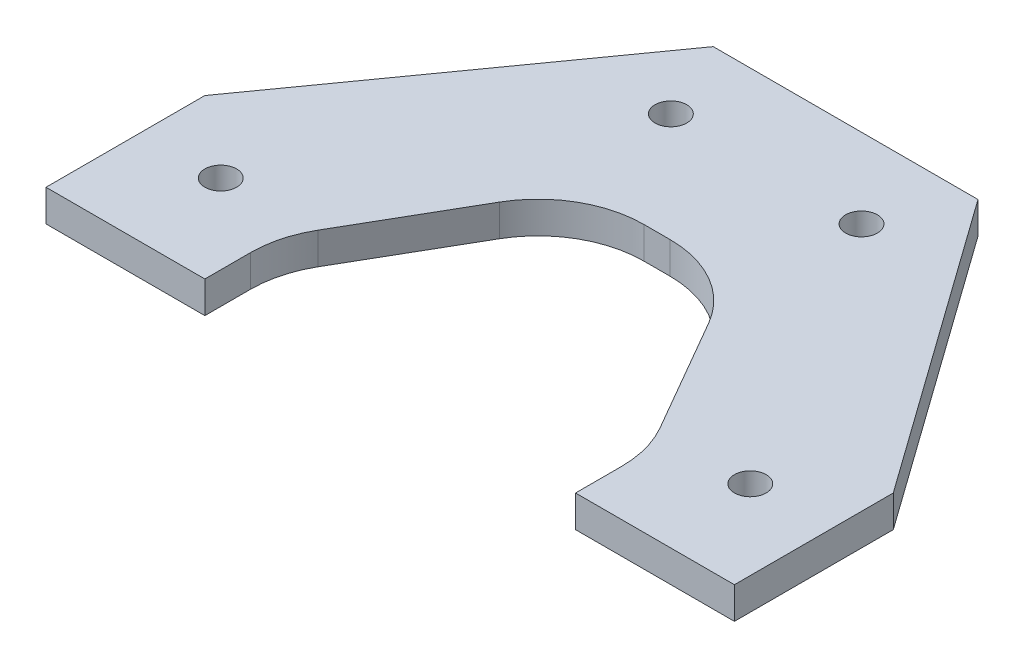
ISO-10303-21;
HEADER;
FILE_DESCRIPTION(('STEP AP214'),'2;1');
FILE_NAME('part.step','',(''),(''),'','','');
FILE_SCHEMA(('AUTOMOTIVE_DESIGN { 1 0 10303 214 1 1 1 1 }'));
ENDSEC;
DATA;
#1=APPLICATION_CONTEXT('core data for automotive mechanical design processes');
#2=APPLICATION_PROTOCOL_DEFINITION('international standard','automotive_design',2000,#1);
#3=PRODUCT_CONTEXT('',#1,'mechanical');
#4=PRODUCT('Part','Part','',(#3));
#5=PRODUCT_RELATED_PRODUCT_CATEGORY('part','',(#4));
#6=PRODUCT_DEFINITION_FORMATION('','',#4);
#7=PRODUCT_DEFINITION_CONTEXT('part definition',#1,'design');
#8=PRODUCT_DEFINITION('design','',#6,#7);
#9=PRODUCT_DEFINITION_SHAPE('','',#8);
#10=(LENGTH_UNIT() NAMED_UNIT(*) SI_UNIT(.MILLI.,.METRE.));
#11=(NAMED_UNIT(*) PLANE_ANGLE_UNIT() SI_UNIT($,.RADIAN.));
#12=(NAMED_UNIT(*) SI_UNIT($,.STERADIAN.) SOLID_ANGLE_UNIT());
#13=UNCERTAINTY_MEASURE_WITH_UNIT(LENGTH_MEASURE(1.E-05),#10,'distance_accuracy_value','');
#14=(GEOMETRIC_REPRESENTATION_CONTEXT(3) GLOBAL_UNCERTAINTY_ASSIGNED_CONTEXT((#13)) GLOBAL_UNIT_ASSIGNED_CONTEXT((#10,
#11,#12)) REPRESENTATION_CONTEXT('',''));
#15=CARTESIAN_POINT('',(0.,0.,0.));
#16=DIRECTION('',(0.,0.,1.));
#17=DIRECTION('',(1.,0.,0.));
#18=AXIS2_PLACEMENT_3D('',#15,#16,#17);
#19=CARTESIAN_POINT('',(-20.,3.,28.));
#20=DIRECTION('',(0.813733471206735,0.,0.581238193719096));
#21=DIRECTION('',(0.581238193719096,0.,-0.813733471206735));
#22=AXIS2_PLACEMENT_3D('',#19,#20,#21);
#23=PLANE('',#22);
#24=DIRECTION('',(-0.581238193719096,0.,0.813733471206735));
#25=VECTOR('',#24,1.);
#26=CARTESIAN_POINT('',(-20.,0.,28.));
#27=LINE('',#26,#25);
#28=CARTESIAN_POINT('',(0.,0.,0.));
#29=VERTEX_POINT('',#28);
#30=CARTESIAN_POINT('',(-20.,0.,28.));
#31=VERTEX_POINT('',#30);
#32=EDGE_CURVE('E181',#29,#31,#27,.T.);
#33=ORIENTED_EDGE('',*,*,#32,.T.);
#34=DIRECTION('',(0.,-1.,0.));
#35=VECTOR('',#34,1.);
#36=CARTESIAN_POINT('',(-20.,3.,28.));
#37=LINE('',#36,#35);
#38=CARTESIAN_POINT('',(-20.,3.,28.));
#39=VERTEX_POINT('',#38);
#40=EDGE_CURVE('E11',#39,#31,#37,.T.);
#41=ORIENTED_EDGE('',*,*,#40,.F.);
#42=DIRECTION('',(-0.581238193719096,0.,0.813733471206735));
#43=VECTOR('',#42,1.);
#44=CARTESIAN_POINT('',(-20.,3.,28.));
#45=LINE('',#44,#43);
#46=CARTESIAN_POINT('',(0.,3.,0.));
#47=VERTEX_POINT('',#46);
#48=EDGE_CURVE('E212',#47,#39,#45,.T.);
#49=ORIENTED_EDGE('',*,*,#48,.F.);
#50=DIRECTION('',(0.,-1.,0.));
#51=VECTOR('',#50,1.);
#52=CARTESIAN_POINT('',(0.,3.,0.));
#53=LINE('',#52,#51);
#54=EDGE_CURVE('E177',#47,#29,#53,.T.);
#55=ORIENTED_EDGE('',*,*,#54,.T.);
#56=EDGE_LOOP('',(#33,#41,#49,#55));
#57=FACE_BOUND('',#56,.T.);
#58=ADVANCED_FACE('F37',(#57),#23,.F.);
#59=CARTESIAN_POINT('',(-20.,3.,43.));
#60=DIRECTION('',(1.,0.,0.));
#61=DIRECTION('',(0.,0.,-1.));
#62=AXIS2_PLACEMENT_3D('',#59,#60,#61);
#63=PLANE('',#62);
#64=DIRECTION('',(0.,0.,1.));
#65=VECTOR('',#64,1.);
#66=CARTESIAN_POINT('',(-20.,0.,43.));
#67=LINE('',#66,#65);
#68=CARTESIAN_POINT('',(-20.,0.,43.));
#69=VERTEX_POINT('',#68);
#70=EDGE_CURVE('E184',#31,#69,#67,.T.);
#71=ORIENTED_EDGE('',*,*,#70,.T.);
#72=DIRECTION('',(0.,-1.,0.));
#73=VECTOR('',#72,1.);
#74=CARTESIAN_POINT('',(-20.,3.,43.));
#75=LINE('',#74,#73);
#76=CARTESIAN_POINT('',(-20.,3.,43.));
#77=VERTEX_POINT('',#76);
#78=EDGE_CURVE('E45',#77,#69,#75,.T.);
#79=ORIENTED_EDGE('',*,*,#78,.F.);
#80=DIRECTION('',(0.,0.,1.));
#81=VECTOR('',#80,1.);
#82=CARTESIAN_POINT('',(-20.,3.,43.));
#83=LINE('',#82,#81);
#84=EDGE_CURVE('E120',#39,#77,#83,.T.);
#85=ORIENTED_EDGE('',*,*,#84,.F.);
#86=ORIENTED_EDGE('',*,*,#40,.T.);
#87=EDGE_LOOP('',(#71,#79,#85,#86));
#88=FACE_BOUND('',#87,.T.);
#89=ADVANCED_FACE('F311',(#88),#63,.F.);
#90=CARTESIAN_POINT('',(-5.,3.,43.));
#91=DIRECTION('',(0.,0.,-1.));
#92=DIRECTION('',(-1.,0.,0.));
#93=AXIS2_PLACEMENT_3D('',#90,#91,#92);
#94=PLANE('',#93);
#95=DIRECTION('',(1.,0.,0.));
#96=VECTOR('',#95,1.);
#97=CARTESIAN_POINT('',(-5.,0.,43.));
#98=LINE('',#97,#96);
#99=CARTESIAN_POINT('',(-5.,0.,43.));
#100=VERTEX_POINT('',#99);
#101=EDGE_CURVE('E187',#69,#100,#98,.T.);
#102=ORIENTED_EDGE('',*,*,#101,.T.);
#103=DIRECTION('',(0.,-1.,0.));
#104=VECTOR('',#103,1.);
#105=CARTESIAN_POINT('',(-5.,3.,43.));
#106=LINE('',#105,#104);
#107=CARTESIAN_POINT('',(-5.,3.,43.));
#108=VERTEX_POINT('',#107);
#109=EDGE_CURVE('E243',#108,#100,#106,.T.);
#110=ORIENTED_EDGE('',*,*,#109,.F.);
#111=DIRECTION('',(1.,0.,0.));
#112=VECTOR('',#111,1.);
#113=CARTESIAN_POINT('',(-5.,3.,43.));
#114=LINE('',#113,#112);
#115=EDGE_CURVE('E251',#77,#108,#114,.T.);
#116=ORIENTED_EDGE('',*,*,#115,.F.);
#117=ORIENTED_EDGE('',*,*,#78,.T.);
#118=EDGE_LOOP('',(#102,#110,#116,#117));
#119=FACE_BOUND('',#118,.T.);
#120=ADVANCED_FACE('F249',(#119),#94,.F.);
#121=CARTESIAN_POINT('',(-5.,3.,38.6794919243113));
#122=DIRECTION('',(-1.,0.,0.));
#123=DIRECTION('',(0.,0.,1.));
#124=AXIS2_PLACEMENT_3D('',#121,#122,#123);
#125=PLANE('',#124);
#126=DIRECTION('',(0.,0.,-1.));
#127=VECTOR('',#126,1.);
#128=CARTESIAN_POINT('',(-5.,0.,38.6794919243113));
#129=LINE('',#128,#127);
#130=CARTESIAN_POINT('',(-5.,0.,38.6794919243112));
#131=VERTEX_POINT('',#130);
#132=EDGE_CURVE('E189',#100,#131,#129,.T.);
#133=ORIENTED_EDGE('',*,*,#132,.T.);
#134=DIRECTION('',(0.,-1.,0.));
#135=VECTOR('',#134,1.);
#136=CARTESIAN_POINT('',(-5.,3.,38.6794919243112));
#137=LINE('',#136,#135);
#138=CARTESIAN_POINT('',(-5.,3.,38.6794919243112));
#139=VERTEX_POINT('',#138);
#140=EDGE_CURVE('E240',#139,#131,#137,.T.);
#141=ORIENTED_EDGE('',*,*,#140,.F.);
#142=DIRECTION('',(0.,0.,-1.));
#143=VECTOR('',#142,1.);
#144=CARTESIAN_POINT('',(-5.,3.,38.6794919243113));
#145=LINE('',#144,#143);
#146=EDGE_CURVE('E269',#108,#139,#145,.T.);
#147=ORIENTED_EDGE('',*,*,#146,.F.);
#148=ORIENTED_EDGE('',*,*,#109,.T.);
#149=EDGE_LOOP('',(#133,#141,#147,#148));
#150=FACE_BOUND('',#149,.T.);
#151=ADVANCED_FACE('F260',(#150),#125,.F.);
#152=CARTESIAN_POINT('',(5.,3.,38.6794919243112));
#153=DIRECTION('',(0.,-1.,0.));
#154=DIRECTION('',(0.,0.,-1.));
#155=AXIS2_PLACEMENT_3D('',#152,#153,#154);
#156=CYLINDRICAL_SURFACE('',#155,10.);
#157=CARTESIAN_POINT('',(5.,0.,38.6794919243112));
#158=DIRECTION('',(0.,-1.,0.));
#159=DIRECTION('',(0.,0.,1.));
#160=AXIS2_PLACEMENT_3D('',#157,#158,#159);
#161=CIRCLE('',#160,10.);
#162=CARTESIAN_POINT('',(-3.66025403784438,0.,33.6794919243112));
#163=VERTEX_POINT('',#162);
#164=EDGE_CURVE('E191',#131,#163,#161,.T.);
#165=ORIENTED_EDGE('',*,*,#164,.T.);
#166=DIRECTION('',(0.,-1.,0.));
#167=VECTOR('',#166,1.);
#168=CARTESIAN_POINT('',(-3.66025403784438,3.,33.6794919243112));
#169=LINE('',#168,#167);
#170=CARTESIAN_POINT('',(-3.66025403784438,3.,33.6794919243112));
#171=VERTEX_POINT('',#170);
#172=EDGE_CURVE('E237',#171,#163,#169,.T.);
#173=ORIENTED_EDGE('',*,*,#172,.F.);
#174=CARTESIAN_POINT('',(5.,3.,38.6794919243112));
#175=DIRECTION('',(0.,-1.,0.));
#176=DIRECTION('',(0.,0.,1.));
#177=AXIS2_PLACEMENT_3D('',#174,#175,#176);
#178=CIRCLE('',#177,10.);
#179=EDGE_CURVE('E266',#139,#171,#178,.T.);
#180=ORIENTED_EDGE('',*,*,#179,.F.);
#181=ORIENTED_EDGE('',*,*,#140,.T.);
#182=EDGE_LOOP('',(#165,#173,#180,#181));
#183=FACE_BOUND('',#182,.T.);
#184=ADVANCED_FACE('F264',(#183),#156,.F.);
#185=CARTESIAN_POINT('',(2.61324865405186,3.,22.8134665205267));
#186=DIRECTION('',(-0.866025403784441,0.,-0.499999999999997));
#187=DIRECTION('',(-0.499999999999997,0.,0.866025403784441));
#188=AXIS2_PLACEMENT_3D('',#185,#186,#187);
#189=PLANE('',#188);
#190=DIRECTION('',(0.499999999999996,0.,-0.866025403784441));
#191=VECTOR('',#190,1.);
#192=CARTESIAN_POINT('',(2.61324865405186,0.,22.8134665205267));
#193=LINE('',#192,#191);
#194=CARTESIAN_POINT('',(2.61324865405187,0.,22.8134665205267));
#195=VERTEX_POINT('',#194);
#196=EDGE_CURVE('E193',#163,#195,#193,.T.);
#197=ORIENTED_EDGE('',*,*,#196,.T.);
#198=DIRECTION('',(0.,-1.,0.));
#199=VECTOR('',#198,1.);
#200=CARTESIAN_POINT('',(2.61324865405187,3.,22.8134665205267));
#201=LINE('',#200,#199);
#202=CARTESIAN_POINT('',(2.61324865405187,3.,22.8134665205267));
#203=VERTEX_POINT('',#202);
#204=EDGE_CURVE('E234',#203,#195,#201,.T.);
#205=ORIENTED_EDGE('',*,*,#204,.F.);
#206=DIRECTION('',(0.499999999999996,0.,-0.866025403784441));
#207=VECTOR('',#206,1.);
#208=CARTESIAN_POINT('',(2.61324865405186,3.,22.8134665205267));
#209=LINE('',#208,#207);
#210=EDGE_CURVE('E268',#171,#203,#209,.T.);
#211=ORIENTED_EDGE('',*,*,#210,.F.);
#212=ORIENTED_EDGE('',*,*,#172,.T.);
#213=EDGE_LOOP('',(#197,#205,#211,#212));
#214=FACE_BOUND('',#213,.T.);
#215=ADVANCED_FACE('F324',(#214),#189,.F.);
#216=CARTESIAN_POINT('',(11.2735026918963,3.,27.8134665205267));
#217=DIRECTION('',(0.,-1.,0.));
#218=DIRECTION('',(0.,0.,-1.));
#219=AXIS2_PLACEMENT_3D('',#216,#217,#218);
#220=CYLINDRICAL_SURFACE('',#219,10.);
#221=CARTESIAN_POINT('',(11.2735026918963,0.,27.8134665205267));
#222=DIRECTION('',(0.,-1.,0.));
#223=DIRECTION('',(0.,0.,1.));
#224=AXIS2_PLACEMENT_3D('',#221,#222,#223);
#225=CIRCLE('',#224,10.);
#226=CARTESIAN_POINT('',(11.2735026918963,0.,17.8134665205267));
#227=VERTEX_POINT('',#226);
#228=EDGE_CURVE('E195',#195,#227,#225,.T.);
#229=ORIENTED_EDGE('',*,*,#228,.T.);
#230=DIRECTION('',(0.,-1.,0.));
#231=VECTOR('',#230,1.);
#232=CARTESIAN_POINT('',(11.2735026918963,3.,17.8134665205267));
#233=LINE('',#232,#231);
#234=CARTESIAN_POINT('',(11.2735026918963,3.,17.8134665205267));
#235=VERTEX_POINT('',#234);
#236=EDGE_CURVE('E231',#235,#227,#233,.T.);
#237=ORIENTED_EDGE('',*,*,#236,.F.);
#238=CARTESIAN_POINT('',(11.2735026918963,3.,27.8134665205267));
#239=DIRECTION('',(0.,-1.,0.));
#240=DIRECTION('',(0.,0.,1.));
#241=AXIS2_PLACEMENT_3D('',#238,#239,#240);
#242=CIRCLE('',#241,10.);
#243=EDGE_CURVE('E271',#203,#235,#242,.T.);
#244=ORIENTED_EDGE('',*,*,#243,.F.);
#245=ORIENTED_EDGE('',*,*,#204,.T.);
#246=EDGE_LOOP('',(#229,#237,#244,#245));
#247=FACE_BOUND('',#246,.T.);
#248=ADVANCED_FACE('F327',(#247),#220,.F.);
#249=CARTESIAN_POINT('',(13.7264973081037,3.,17.8134665205267));
#250=DIRECTION('',(0.,0.,-1.));
#251=DIRECTION('',(-1.,0.,0.));
#252=AXIS2_PLACEMENT_3D('',#249,#250,#251);
#253=PLANE('',#252);
#254=DIRECTION('',(1.,0.,0.));
#255=VECTOR('',#254,1.);
#256=CARTESIAN_POINT('',(13.7264973081037,0.,17.8134665205267));
#257=LINE('',#256,#255);
#258=CARTESIAN_POINT('',(13.7264973081037,0.,17.8134665205267));
#259=VERTEX_POINT('',#258);
#260=EDGE_CURVE('E197',#227,#259,#257,.T.);
#261=ORIENTED_EDGE('',*,*,#260,.T.);
#262=DIRECTION('',(0.,-1.,0.));
#263=VECTOR('',#262,1.);
#264=CARTESIAN_POINT('',(13.7264973081037,3.,17.8134665205267));
#265=LINE('',#264,#263);
#266=CARTESIAN_POINT('',(13.7264973081037,3.,17.8134665205267));
#267=VERTEX_POINT('',#266);
#268=EDGE_CURVE('E228',#267,#259,#265,.T.);
#269=ORIENTED_EDGE('',*,*,#268,.F.);
#270=DIRECTION('',(1.,0.,0.));
#271=VECTOR('',#270,1.);
#272=CARTESIAN_POINT('',(13.7264973081037,3.,17.8134665205267));
#273=LINE('',#272,#271);
#274=EDGE_CURVE('E277',#235,#267,#273,.T.);
#275=ORIENTED_EDGE('',*,*,#274,.F.);
#276=ORIENTED_EDGE('',*,*,#236,.T.);
#277=EDGE_LOOP('',(#261,#269,#275,#276));
#278=FACE_BOUND('',#277,.T.);
#279=ADVANCED_FACE('F331',(#278),#253,.F.);
#280=CARTESIAN_POINT('',(13.7264973081037,3.,27.8134665205267));
#281=DIRECTION('',(0.,-1.,0.));
#282=DIRECTION('',(0.,0.,-1.));
#283=AXIS2_PLACEMENT_3D('',#280,#281,#282);
#284=CYLINDRICAL_SURFACE('',#283,10.);
#285=CARTESIAN_POINT('',(13.7264973081037,0.,27.8134665205267));
#286=DIRECTION('',(0.,-1.,0.));
#287=DIRECTION('',(0.,0.,1.));
#288=AXIS2_PLACEMENT_3D('',#285,#286,#287);
#289=CIRCLE('',#288,10.);
#290=CARTESIAN_POINT('',(22.3867513459481,0.,22.8134665205267));
#291=VERTEX_POINT('',#290);
#292=EDGE_CURVE('E199',#259,#291,#289,.T.);
#293=ORIENTED_EDGE('',*,*,#292,.T.);
#294=DIRECTION('',(0.,-1.,0.));
#295=VECTOR('',#294,1.);
#296=CARTESIAN_POINT('',(22.3867513459481,3.,22.8134665205267));
#297=LINE('',#296,#295);
#298=CARTESIAN_POINT('',(22.3867513459481,3.,22.8134665205267));
#299=VERTEX_POINT('',#298);
#300=EDGE_CURVE('E225',#299,#291,#297,.T.);
#301=ORIENTED_EDGE('',*,*,#300,.F.);
#302=CARTESIAN_POINT('',(13.7264973081037,3.,27.8134665205267));
#303=DIRECTION('',(0.,-1.,0.));
#304=DIRECTION('',(0.,0.,1.));
#305=AXIS2_PLACEMENT_3D('',#302,#303,#304);
#306=CIRCLE('',#305,10.);
#307=EDGE_CURVE('E279',#267,#299,#306,.T.);
#308=ORIENTED_EDGE('',*,*,#307,.F.);
#309=ORIENTED_EDGE('',*,*,#268,.T.);
#310=EDGE_LOOP('',(#293,#301,#308,#309));
#311=FACE_BOUND('',#310,.T.);
#312=ADVANCED_FACE('F335',(#311),#284,.F.);
#313=CARTESIAN_POINT('',(22.3867513459481,3.,22.8134665205267));
#314=DIRECTION('',(0.86602540378444,0.,-0.499999999999998));
#315=DIRECTION('',(-0.499999999999998,0.,-0.86602540378444));
#316=AXIS2_PLACEMENT_3D('',#313,#314,#315);
#317=PLANE('',#316);
#318=DIRECTION('',(0.499999999999998,0.,0.86602540378444));
#319=VECTOR('',#318,1.);
#320=CARTESIAN_POINT('',(22.3867513459481,0.,22.8134665205267));
#321=LINE('',#320,#319);
#322=CARTESIAN_POINT('',(28.6602540378444,0.,33.6794919243112));
#323=VERTEX_POINT('',#322);
#324=EDGE_CURVE('E201',#291,#323,#321,.T.);
#325=ORIENTED_EDGE('',*,*,#324,.T.);
#326=DIRECTION('',(0.,-1.,0.));
#327=VECTOR('',#326,1.);
#328=CARTESIAN_POINT('',(28.6602540378444,3.,33.6794919243112));
#329=LINE('',#328,#327);
#330=CARTESIAN_POINT('',(28.6602540378444,3.,33.6794919243112));
#331=VERTEX_POINT('',#330);
#332=EDGE_CURVE('E222',#331,#323,#329,.T.);
#333=ORIENTED_EDGE('',*,*,#332,.F.);
#334=DIRECTION('',(0.499999999999998,0.,0.86602540378444));
#335=VECTOR('',#334,1.);
#336=CARTESIAN_POINT('',(22.3867513459481,3.,22.8134665205267));
#337=LINE('',#336,#335);
#338=EDGE_CURVE('E281',#299,#331,#337,.T.);
#339=ORIENTED_EDGE('',*,*,#338,.F.);
#340=ORIENTED_EDGE('',*,*,#300,.T.);
#341=EDGE_LOOP('',(#325,#333,#339,#340));
#342=FACE_BOUND('',#341,.T.);
#343=ADVANCED_FACE('F339',(#342),#317,.F.);
#344=CARTESIAN_POINT('',(20.,3.,38.6794919243112));
#345=DIRECTION('',(0.,-1.,0.));
#346=DIRECTION('',(0.,0.,-1.));
#347=AXIS2_PLACEMENT_3D('',#344,#345,#346);
#348=CYLINDRICAL_SURFACE('',#347,9.99999999999999);
#349=CARTESIAN_POINT('',(20.,0.,38.6794919243112));
#350=DIRECTION('',(0.,-1.,0.));
#351=DIRECTION('',(0.,0.,1.));
#352=AXIS2_PLACEMENT_3D('',#349,#350,#351);
#353=CIRCLE('',#352,9.99999999999999);
#354=CARTESIAN_POINT('',(30.,0.,38.6794919243112));
#355=VERTEX_POINT('',#354);
#356=EDGE_CURVE('E203',#323,#355,#353,.T.);
#357=ORIENTED_EDGE('',*,*,#356,.T.);
#358=DIRECTION('',(0.,-1.,0.));
#359=VECTOR('',#358,1.);
#360=CARTESIAN_POINT('',(30.,3.,38.6794919243112));
#361=LINE('',#360,#359);
#362=CARTESIAN_POINT('',(30.,3.,38.6794919243112));
#363=VERTEX_POINT('',#362);
#364=EDGE_CURVE('E219',#363,#355,#361,.T.);
#365=ORIENTED_EDGE('',*,*,#364,.F.);
#366=CARTESIAN_POINT('',(20.,3.,38.6794919243112));
#367=DIRECTION('',(0.,-1.,0.));
#368=DIRECTION('',(0.,0.,1.));
#369=AXIS2_PLACEMENT_3D('',#366,#367,#368);
#370=CIRCLE('',#369,9.99999999999999);
#371=EDGE_CURVE('E283',#331,#363,#370,.T.);
#372=ORIENTED_EDGE('',*,*,#371,.F.);
#373=ORIENTED_EDGE('',*,*,#332,.T.);
#374=EDGE_LOOP('',(#357,#365,#372,#373));
#375=FACE_BOUND('',#374,.T.);
#376=ADVANCED_FACE('F343',(#375),#348,.F.);
#377=CARTESIAN_POINT('',(30.,3.,38.6794919243112));
#378=DIRECTION('',(1.,0.,0.));
#379=DIRECTION('',(0.,0.,-1.));
#380=AXIS2_PLACEMENT_3D('',#377,#378,#379);
#381=PLANE('',#380);
#382=DIRECTION('',(0.,0.,1.));
#383=VECTOR('',#382,1.);
#384=CARTESIAN_POINT('',(30.,0.,38.6794919243112));
#385=LINE('',#384,#383);
#386=CARTESIAN_POINT('',(30.,0.,43.));
#387=VERTEX_POINT('',#386);
#388=EDGE_CURVE('E205',#355,#387,#385,.T.);
#389=ORIENTED_EDGE('',*,*,#388,.T.);
#390=DIRECTION('',(0.,-1.,0.));
#391=VECTOR('',#390,1.);
#392=CARTESIAN_POINT('',(30.,3.,43.));
#393=LINE('',#392,#391);
#394=CARTESIAN_POINT('',(30.,3.,43.));
#395=VERTEX_POINT('',#394);
#396=EDGE_CURVE('E216',#395,#387,#393,.T.);
#397=ORIENTED_EDGE('',*,*,#396,.F.);
#398=DIRECTION('',(0.,0.,1.));
#399=VECTOR('',#398,1.);
#400=CARTESIAN_POINT('',(30.,3.,38.6794919243112));
#401=LINE('',#400,#399);
#402=EDGE_CURVE('E285',#363,#395,#401,.T.);
#403=ORIENTED_EDGE('',*,*,#402,.F.);
#404=ORIENTED_EDGE('',*,*,#364,.T.);
#405=EDGE_LOOP('',(#389,#397,#403,#404));
#406=FACE_BOUND('',#405,.T.);
#407=ADVANCED_FACE('F291',(#406),#381,.F.);
#408=CARTESIAN_POINT('',(30.,3.,43.));
#409=DIRECTION('',(0.,0.,-1.));
#410=DIRECTION('',(-1.,0.,0.));
#411=AXIS2_PLACEMENT_3D('',#408,#409,#410);
#412=PLANE('',#411);
#413=DIRECTION('',(1.,0.,0.));
#414=VECTOR('',#413,1.);
#415=CARTESIAN_POINT('',(30.,0.,43.));
#416=LINE('',#415,#414);
#417=CARTESIAN_POINT('',(45.,0.,43.));
#418=VERTEX_POINT('',#417);
#419=EDGE_CURVE('E207',#387,#418,#416,.T.);
#420=ORIENTED_EDGE('',*,*,#419,.T.);
#421=DIRECTION('',(0.,-1.,0.));
#422=VECTOR('',#421,1.);
#423=CARTESIAN_POINT('',(45.,3.,43.));
#424=LINE('',#423,#422);
#425=CARTESIAN_POINT('',(45.,3.,43.));
#426=VERTEX_POINT('',#425);
#427=EDGE_CURVE('E172',#426,#418,#424,.T.);
#428=ORIENTED_EDGE('',*,*,#427,.F.);
#429=DIRECTION('',(1.,0.,0.));
#430=VECTOR('',#429,1.);
#431=CARTESIAN_POINT('',(30.,3.,43.));
#432=LINE('',#431,#430);
#433=EDGE_CURVE('E163',#395,#426,#432,.T.);
#434=ORIENTED_EDGE('',*,*,#433,.F.);
#435=ORIENTED_EDGE('',*,*,#396,.T.);
#436=EDGE_LOOP('',(#420,#428,#434,#435));
#437=FACE_BOUND('',#436,.T.);
#438=ADVANCED_FACE('F295',(#437),#412,.F.);
#439=CARTESIAN_POINT('',(45.,3.,43.));
#440=DIRECTION('',(-1.,0.,0.));
#441=DIRECTION('',(0.,0.,1.));
#442=AXIS2_PLACEMENT_3D('',#439,#440,#441);
#443=PLANE('',#442);
#444=DIRECTION('',(0.,0.,-1.));
#445=VECTOR('',#444,1.);
#446=CARTESIAN_POINT('',(45.,0.,43.));
#447=LINE('',#446,#445);
#448=CARTESIAN_POINT('',(45.,0.,28.));
#449=VERTEX_POINT('',#448);
#450=EDGE_CURVE('E171',#418,#449,#447,.T.);
#451=ORIENTED_EDGE('',*,*,#450,.T.);
#452=DIRECTION('',(0.,-1.,0.));
#453=VECTOR('',#452,1.);
#454=CARTESIAN_POINT('',(45.,3.,28.));
#455=LINE('',#454,#453);
#456=CARTESIAN_POINT('',(45.,3.,28.));
#457=VERTEX_POINT('',#456);
#458=EDGE_CURVE('E168',#457,#449,#455,.T.);
#459=ORIENTED_EDGE('',*,*,#458,.F.);
#460=DIRECTION('',(0.,0.,-1.));
#461=VECTOR('',#460,1.);
#462=CARTESIAN_POINT('',(45.,3.,43.));
#463=LINE('',#462,#461);
#464=EDGE_CURVE('E157',#426,#457,#463,.T.);
#465=ORIENTED_EDGE('',*,*,#464,.F.);
#466=ORIENTED_EDGE('',*,*,#427,.T.);
#467=EDGE_LOOP('',(#451,#459,#465,#466));
#468=FACE_BOUND('',#467,.T.);
#469=ADVANCED_FACE('F169',(#468),#443,.F.);
#470=CARTESIAN_POINT('',(45.,3.,28.));
#471=DIRECTION('',(-0.813733471206735,0.,0.581238193719096));
#472=DIRECTION('',(0.581238193719096,0.,0.813733471206735));
#473=AXIS2_PLACEMENT_3D('',#470,#471,#472);
#474=PLANE('',#473);
#475=DIRECTION('',(-0.581238193719096,0.,-0.813733471206735));
#476=VECTOR('',#475,1.);
#477=CARTESIAN_POINT('',(45.,0.,28.));
#478=LINE('',#477,#476);
#479=CARTESIAN_POINT('',(25.,0.,0.));
#480=VERTEX_POINT('',#479);
#481=EDGE_CURVE('E106',#449,#480,#478,.T.);
#482=ORIENTED_EDGE('',*,*,#481,.T.);
#483=DIRECTION('',(0.,-1.,0.));
#484=VECTOR('',#483,1.);
#485=CARTESIAN_POINT('',(25.,3.,0.));
#486=LINE('',#485,#484);
#487=CARTESIAN_POINT('',(25.,3.,0.));
#488=VERTEX_POINT('',#487);
#489=EDGE_CURVE('E173',#488,#480,#486,.T.);
#490=ORIENTED_EDGE('',*,*,#489,.F.);
#491=DIRECTION('',(-0.581238193719096,0.,-0.813733471206735));
#492=VECTOR('',#491,1.);
#493=CARTESIAN_POINT('',(45.,3.,28.));
#494=LINE('',#493,#492);
#495=EDGE_CURVE('E161',#457,#488,#494,.T.);
#496=ORIENTED_EDGE('',*,*,#495,.F.);
#497=ORIENTED_EDGE('',*,*,#458,.T.);
#498=EDGE_LOOP('',(#482,#490,#496,#497));
#499=FACE_BOUND('',#498,.T.);
#500=ADVANCED_FACE('F175',(#499),#474,.F.);
#501=CARTESIAN_POINT('',(0.,3.,0.));
#502=DIRECTION('',(0.,0.,1.));
#503=DIRECTION('',(1.,0.,0.));
#504=AXIS2_PLACEMENT_3D('',#501,#502,#503);
#505=PLANE('',#504);
#506=DIRECTION('',(-1.,0.,0.));
#507=VECTOR('',#506,1.);
#508=CARTESIAN_POINT('',(0.,0.,0.));
#509=LINE('',#508,#507);
#510=EDGE_CURVE('E112',#480,#29,#509,.T.);
#511=ORIENTED_EDGE('',*,*,#510,.T.);
#512=ORIENTED_EDGE('',*,*,#54,.F.);
#513=DIRECTION('',(-1.,0.,0.));
#514=VECTOR('',#513,1.);
#515=CARTESIAN_POINT('',(0.,3.,0.));
#516=LINE('',#515,#514);
#517=EDGE_CURVE('E53',#488,#47,#516,.T.);
#518=ORIENTED_EDGE('',*,*,#517,.F.);
#519=ORIENTED_EDGE('',*,*,#489,.T.);
#520=EDGE_LOOP('',(#511,#512,#518,#519));
#521=FACE_BOUND('',#520,.T.);
#522=ADVANCED_FACE('F299',(#521),#505,.F.);
#523=CARTESIAN_POINT('',(20.,3.,38.6794919243112));
#524=DIRECTION('',(0.,1.,0.));
#525=DIRECTION('',(0.,0.,1.));
#526=AXIS2_PLACEMENT_3D('',#523,#524,#525);
#527=PLANE('',#526);
#528=CARTESIAN_POINT('',(-12.5,3.,34.));
#529=DIRECTION('',(0.,1.,0.));
#530=DIRECTION('',(0.,0.,1.));
#531=AXIS2_PLACEMENT_3D('',#528,#529,#530);
#532=CIRCLE('',#531,1.5);
#533=CARTESIAN_POINT('',(-12.5,3.,35.5));
#534=VERTEX_POINT('',#533);
#535=EDGE_CURVE('E428',#534,#534,#532,.T.);
#536=ORIENTED_EDGE('',*,*,#535,.F.);
#537=EDGE_LOOP('',(#536));
#538=FACE_BOUND('',#537,.T.);
#539=CARTESIAN_POINT('',(37.5,3.,34.));
#540=DIRECTION('',(0.,1.,0.));
#541=DIRECTION('',(0.,0.,1.));
#542=AXIS2_PLACEMENT_3D('',#539,#540,#541);
#543=CIRCLE('',#542,1.5);
#544=CARTESIAN_POINT('',(37.5,3.,35.5));
#545=VERTEX_POINT('',#544);
#546=EDGE_CURVE('E433',#545,#545,#543,.T.);
#547=ORIENTED_EDGE('',*,*,#546,.F.);
#548=EDGE_LOOP('',(#547));
#549=FACE_BOUND('',#548,.T.);
#550=CARTESIAN_POINT('',(21.5,3.,7.49999999999999));
#551=DIRECTION('',(0.,1.,0.));
#552=DIRECTION('',(0.,0.,1.));
#553=AXIS2_PLACEMENT_3D('',#550,#551,#552);
#554=CIRCLE('',#553,1.5);
#555=CARTESIAN_POINT('',(21.5,3.,8.99999999999999));
#556=VERTEX_POINT('',#555);
#557=EDGE_CURVE('E441',#556,#556,#554,.T.);
#558=ORIENTED_EDGE('',*,*,#557,.F.);
#559=EDGE_LOOP('',(#558));
#560=FACE_BOUND('',#559,.T.);
#561=CARTESIAN_POINT('',(3.5,3.,7.49999999999999));
#562=DIRECTION('',(0.,1.,0.));
#563=DIRECTION('',(0.,0.,1.));
#564=AXIS2_PLACEMENT_3D('',#561,#562,#563);
#565=CIRCLE('',#564,1.5);
#566=CARTESIAN_POINT('',(3.5,3.,8.99999999999999));
#567=VERTEX_POINT('',#566);
#568=EDGE_CURVE('E447',#567,#567,#565,.T.);
#569=ORIENTED_EDGE('',*,*,#568,.F.);
#570=EDGE_LOOP('',(#569));
#571=FACE_BOUND('',#570,.T.);
#572=ORIENTED_EDGE('',*,*,#48,.T.);
#573=ORIENTED_EDGE('',*,*,#84,.T.);
#574=ORIENTED_EDGE('',*,*,#115,.T.);
#575=ORIENTED_EDGE('',*,*,#146,.T.);
#576=ORIENTED_EDGE('',*,*,#179,.T.);
#577=ORIENTED_EDGE('',*,*,#210,.T.);
#578=ORIENTED_EDGE('',*,*,#243,.T.);
#579=ORIENTED_EDGE('',*,*,#274,.T.);
#580=ORIENTED_EDGE('',*,*,#307,.T.);
#581=ORIENTED_EDGE('',*,*,#338,.T.);
#582=ORIENTED_EDGE('',*,*,#371,.T.);
#583=ORIENTED_EDGE('',*,*,#402,.T.);
#584=ORIENTED_EDGE('',*,*,#433,.T.);
#585=ORIENTED_EDGE('',*,*,#464,.T.);
#586=ORIENTED_EDGE('',*,*,#495,.T.);
#587=ORIENTED_EDGE('',*,*,#517,.T.);
#588=EDGE_LOOP('',(#572,#573,#574,#575,#576,#577,#578,#579,#580,#581,#582,#583,#584,#585,#586,#587));
#589=FACE_BOUND('',#588,.T.);
#590=ADVANCED_FACE('F159',(#538,#549,#560,#571,#589),#527,.T.);
#591=CARTESIAN_POINT('',(20.,0.,38.6794919243112));
#592=DIRECTION('',(0.,1.,0.));
#593=DIRECTION('',(0.,0.,1.));
#594=AXIS2_PLACEMENT_3D('',#591,#592,#593);
#595=PLANE('',#594);
#596=CARTESIAN_POINT('',(-12.5,0.,34.));
#597=DIRECTION('',(0.,1.,0.));
#598=DIRECTION('',(0.,0.,1.));
#599=AXIS2_PLACEMENT_3D('',#596,#597,#598);
#600=CIRCLE('',#599,1.5);
#601=CARTESIAN_POINT('',(-12.5,0.,35.5));
#602=VERTEX_POINT('',#601);
#603=EDGE_CURVE('E185',#602,#602,#600,.T.);
#604=ORIENTED_EDGE('',*,*,#603,.T.);
#605=EDGE_LOOP('',(#604));
#606=FACE_BOUND('',#605,.T.);
#607=CARTESIAN_POINT('',(37.5,0.,34.));
#608=DIRECTION('',(0.,1.,0.));
#609=DIRECTION('',(0.,0.,1.));
#610=AXIS2_PLACEMENT_3D('',#607,#608,#609);
#611=CIRCLE('',#610,1.5);
#612=CARTESIAN_POINT('',(37.5,0.,35.5));
#613=VERTEX_POINT('',#612);
#614=EDGE_CURVE('E429',#613,#613,#611,.T.);
#615=ORIENTED_EDGE('',*,*,#614,.T.);
#616=EDGE_LOOP('',(#615));
#617=FACE_BOUND('',#616,.T.);
#618=CARTESIAN_POINT('',(21.5,0.,7.49999999999999));
#619=DIRECTION('',(0.,1.,0.));
#620=DIRECTION('',(0.,0.,1.));
#621=AXIS2_PLACEMENT_3D('',#618,#619,#620);
#622=CIRCLE('',#621,1.5);
#623=CARTESIAN_POINT('',(21.5,0.,8.99999999999999));
#624=VERTEX_POINT('',#623);
#625=EDGE_CURVE('E438',#624,#624,#622,.T.);
#626=ORIENTED_EDGE('',*,*,#625,.T.);
#627=EDGE_LOOP('',(#626));
#628=FACE_BOUND('',#627,.T.);
#629=CARTESIAN_POINT('',(3.5,0.,7.49999999999999));
#630=DIRECTION('',(0.,1.,0.));
#631=DIRECTION('',(0.,0.,1.));
#632=AXIS2_PLACEMENT_3D('',#629,#630,#631);
#633=CIRCLE('',#632,1.5);
#634=CARTESIAN_POINT('',(3.5,0.,8.99999999999999));
#635=VERTEX_POINT('',#634);
#636=EDGE_CURVE('E444',#635,#635,#633,.T.);
#637=ORIENTED_EDGE('',*,*,#636,.T.);
#638=EDGE_LOOP('',(#637));
#639=FACE_BOUND('',#638,.T.);
#640=ORIENTED_EDGE('',*,*,#32,.F.);
#641=ORIENTED_EDGE('',*,*,#510,.F.);
#642=ORIENTED_EDGE('',*,*,#481,.F.);
#643=ORIENTED_EDGE('',*,*,#450,.F.);
#644=ORIENTED_EDGE('',*,*,#419,.F.);
#645=ORIENTED_EDGE('',*,*,#388,.F.);
#646=ORIENTED_EDGE('',*,*,#356,.F.);
#647=ORIENTED_EDGE('',*,*,#324,.F.);
#648=ORIENTED_EDGE('',*,*,#292,.F.);
#649=ORIENTED_EDGE('',*,*,#260,.F.);
#650=ORIENTED_EDGE('',*,*,#228,.F.);
#651=ORIENTED_EDGE('',*,*,#196,.F.);
#652=ORIENTED_EDGE('',*,*,#164,.F.);
#653=ORIENTED_EDGE('',*,*,#132,.F.);
#654=ORIENTED_EDGE('',*,*,#101,.F.);
#655=ORIENTED_EDGE('',*,*,#70,.F.);
#656=EDGE_LOOP('',(#640,#641,#642,#643,#644,#645,#646,#647,#648,#649,#650,#651,#652,#653,#654,#655));
#657=FACE_BOUND('',#656,.T.);
#658=ADVANCED_FACE('F255',(#606,#617,#628,#639,#657),#595,.F.);
#659=CARTESIAN_POINT('',(3.5,0.,7.49999999999999));
#660=DIRECTION('',(0.,1.,0.));
#661=DIRECTION('',(0.,0.,1.));
#662=AXIS2_PLACEMENT_3D('',#659,#660,#661);
#663=CYLINDRICAL_SURFACE('',#662,1.5);
#664=ORIENTED_EDGE('',*,*,#636,.F.);
#665=EDGE_LOOP('',(#664));
#666=FACE_BOUND('',#665,.T.);
#667=ORIENTED_EDGE('',*,*,#568,.T.);
#668=EDGE_LOOP('',(#667));
#669=FACE_BOUND('',#668,.T.);
#670=ADVANCED_FACE('F380',(#666,#669),#663,.F.);
#671=CARTESIAN_POINT('',(21.5,0.,7.49999999999999));
#672=DIRECTION('',(0.,1.,0.));
#673=DIRECTION('',(0.,0.,1.));
#674=AXIS2_PLACEMENT_3D('',#671,#672,#673);
#675=CYLINDRICAL_SURFACE('',#674,1.5);
#676=ORIENTED_EDGE('',*,*,#625,.F.);
#677=EDGE_LOOP('',(#676));
#678=FACE_BOUND('',#677,.T.);
#679=ORIENTED_EDGE('',*,*,#557,.T.);
#680=EDGE_LOOP('',(#679));
#681=FACE_BOUND('',#680,.T.);
#682=ADVANCED_FACE('F389',(#678,#681),#675,.F.);
#683=CARTESIAN_POINT('',(37.5,0.,34.));
#684=DIRECTION('',(0.,1.,0.));
#685=DIRECTION('',(0.,0.,1.));
#686=AXIS2_PLACEMENT_3D('',#683,#684,#685);
#687=CYLINDRICAL_SURFACE('',#686,1.5);
#688=ORIENTED_EDGE('',*,*,#614,.F.);
#689=EDGE_LOOP('',(#688));
#690=FACE_BOUND('',#689,.T.);
#691=ORIENTED_EDGE('',*,*,#546,.T.);
#692=EDGE_LOOP('',(#691));
#693=FACE_BOUND('',#692,.T.);
#694=ADVANCED_FACE('F399',(#690,#693),#687,.F.);
#695=CARTESIAN_POINT('',(-12.5,0.,34.));
#696=DIRECTION('',(0.,1.,0.));
#697=DIRECTION('',(0.,0.,1.));
#698=AXIS2_PLACEMENT_3D('',#695,#696,#697);
#699=CYLINDRICAL_SURFACE('',#698,1.5);
#700=ORIENTED_EDGE('',*,*,#603,.F.);
#701=EDGE_LOOP('',(#700));
#702=FACE_BOUND('',#701,.T.);
#703=ORIENTED_EDGE('',*,*,#535,.T.);
#704=EDGE_LOOP('',(#703));
#705=FACE_BOUND('',#704,.T.);
#706=ADVANCED_FACE('F409',(#702,#705),#699,.F.);
#707=CLOSED_SHELL('',(#58,#89,#120,#151,#184,#215,#248,#279,#312,#343,#376,#407,#438,#469,#500,
#522,#590,#658,#670,#682,#694,#706));
#708=MANIFOLD_SOLID_BREP('B2',#707);
#709=ADVANCED_BREP_SHAPE_REPRESENTATION('',(#18,#708),#14);
#710=SHAPE_DEFINITION_REPRESENTATION(#9,#709);
ENDSEC;
END-ISO-10303-21;
